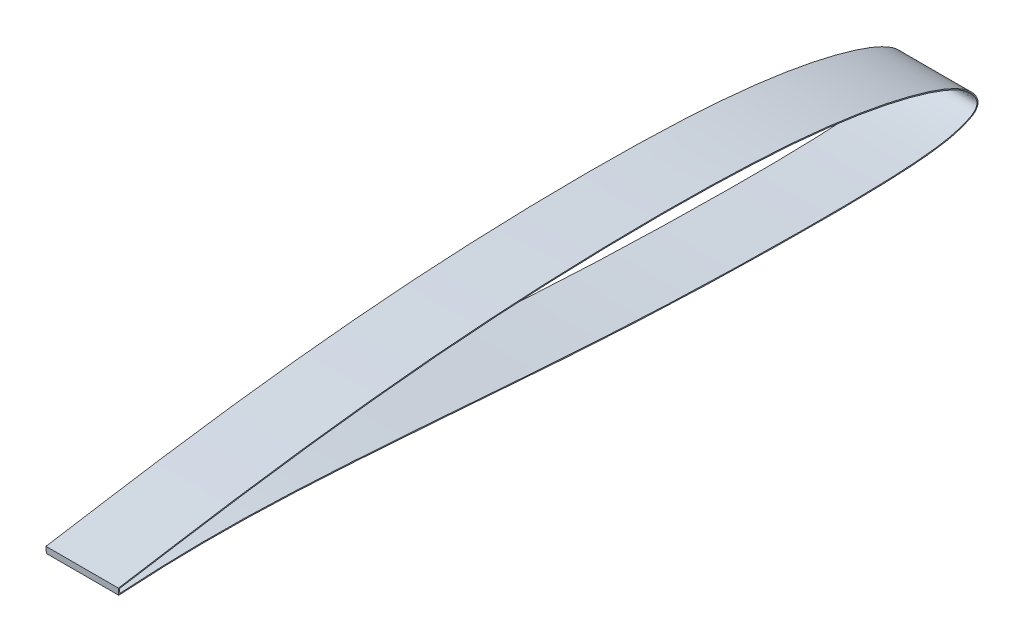
ISO-10303-21;
HEADER;
FILE_DESCRIPTION(('STEP AP214'),'2;1');
FILE_NAME('part.step','',(''),(''),'','','');
FILE_SCHEMA(('AUTOMOTIVE_DESIGN { 1 0 10303 214 1 1 1 1 }'));
ENDSEC;
DATA;
#1=APPLICATION_CONTEXT('core data for automotive mechanical design processes');
#2=APPLICATION_PROTOCOL_DEFINITION('international standard','automotive_design',2000,#1);
#3=PRODUCT_CONTEXT('',#1,'mechanical');
#4=PRODUCT('Part','Part','',(#3));
#5=PRODUCT_RELATED_PRODUCT_CATEGORY('part','',(#4));
#6=PRODUCT_DEFINITION_FORMATION('','',#4);
#7=PRODUCT_DEFINITION_CONTEXT('part definition',#1,'design');
#8=PRODUCT_DEFINITION('design','',#6,#7);
#9=PRODUCT_DEFINITION_SHAPE('','',#8);
#10=(LENGTH_UNIT() NAMED_UNIT(*) SI_UNIT(.MILLI.,.METRE.));
#11=(NAMED_UNIT(*) PLANE_ANGLE_UNIT() SI_UNIT($,.RADIAN.));
#12=(NAMED_UNIT(*) SI_UNIT($,.STERADIAN.) SOLID_ANGLE_UNIT());
#13=UNCERTAINTY_MEASURE_WITH_UNIT(LENGTH_MEASURE(1.E-05),#10,'distance_accuracy_value','');
#14=(GEOMETRIC_REPRESENTATION_CONTEXT(3) GLOBAL_UNCERTAINTY_ASSIGNED_CONTEXT((#13)) GLOBAL_UNIT_ASSIGNED_CONTEXT((#10,
#11,#12)) REPRESENTATION_CONTEXT('',''));
#15=CARTESIAN_POINT('',(0.,0.,0.));
#16=DIRECTION('',(0.,0.,1.));
#17=DIRECTION('',(1.,0.,0.));
#18=AXIS2_PLACEMENT_3D('',#15,#16,#17);
#19=CARTESIAN_POINT('',(20.,1.64115052743639,0.171932989034191));
#20=DIRECTION('',(-1.,0.,0.));
#21=DIRECTION('',(0.,0.,1.));
#22=AXIS2_PLACEMENT_3D('',#19,#20,#21);
#23=PLANE('',#22);
#24=CARTESIAN_POINT('',(20.,0.00851203113730381,250.299879217896));
#25=CARTESIAN_POINT('',(20.,-0.0415942590162992,250.300610440767));
#26=CARTESIAN_POINT('',(20.,-0.152161860770837,250.272506801154));
#27=CARTESIAN_POINT('',(20.,-0.259965331737343,250.167522590776));
#28=CARTESIAN_POINT('',(20.,-0.284593038341012,250.096781737222));
#29=CARTESIAN_POINT('',(20.,-0.295657832195406,250.057124680893));
#30=CARTESIAN_POINT('',(20.,-0.299589513553123,250.026592719769));
#31=CARTESIAN_POINT('',(20.,-0.300788545775397,250.007637867982));
#32=CARTESIAN_POINT('',(20.,-0.301054379074273,249.988212512625));
#33=CARTESIAN_POINT('',(20.,-0.30059721191853,249.972342631143));
#34=CARTESIAN_POINT('',(20.,-0.299715526481863,249.954348045777));
#35=CARTESIAN_POINT('',(20.,-0.298497464499674,249.93549893126));
#36=CARTESIAN_POINT('',(20.,-0.296458505735992,249.907843325712));
#37=CARTESIAN_POINT('',(20.,-0.293133835202882,249.867841257151));
#38=CARTESIAN_POINT('',(20.,-0.287998729290465,249.810943218763));
#39=CARTESIAN_POINT('',(20.,-0.279801997220732,249.724390350209));
#40=CARTESIAN_POINT('',(20.,-0.267388415798908,249.59880987299));
#41=CARTESIAN_POINT('',(20.,-0.25031768000012,249.430459515597));
#42=CARTESIAN_POINT('',(20.,-0.226273804968027,249.195382682965));
#43=CARTESIAN_POINT('',(20.,-0.198009291952686,248.915327795734));
#44=CARTESIAN_POINT('',(20.,-0.168358731904941,248.612353141811));
#45=CARTESIAN_POINT('',(20.,-0.133192974381476,248.242015094353));
#46=CARTESIAN_POINT('',(20.,-0.0964390058673635,247.834242708697));
#47=CARTESIAN_POINT('',(20.,-0.0595236681232221,247.398464530492));
#48=CARTESIAN_POINT('',(20.,-0.01480301413068,246.847910816136));
#49=CARTESIAN_POINT('',(20.,0.0458874341870452,246.111558123038));
#50=CARTESIAN_POINT('',(20.,0.128254179339114,245.137192793484));
#51=CARTESIAN_POINT('',(20.,0.243670253642688,243.772743085392));
#52=CARTESIAN_POINT('',(20.,0.38650761134497,242.03921317083));
#53=CARTESIAN_POINT('',(20.,0.536484673338993,240.063200336767));
#54=CARTESIAN_POINT('',(20.,0.673723383554997,238.119323561757));
#55=CARTESIAN_POINT('',(20.,0.802802158334246,236.16814930186));
#56=CARTESIAN_POINT('',(20.,0.96625171519915,233.536179450592));
#57=CARTESIAN_POINT('',(20.,1.14972586909803,230.220754521479));
#58=CARTESIAN_POINT('',(20.,1.32686721965274,226.261301818986));
#59=CARTESIAN_POINT('',(20.,1.46217380664256,222.310221851806));
#60=CARTESIAN_POINT('',(20.,1.58907599436371,217.034536948074));
#61=CARTESIAN_POINT('',(20.,1.6469298796479,210.429947600971));
#62=CARTESIAN_POINT('',(20.,1.55709956014121,202.510880005302));
#63=CARTESIAN_POINT('',(20.,1.32519296729882,194.592958559664));
#64=CARTESIAN_POINT('',(20.,0.981660944201321,186.677117851058));
#65=CARTESIAN_POINT('',(20.,0.556908077384676,178.765161733083));
#66=CARTESIAN_POINT('',(20.,-0.0953813518286871,168.219890218321));
#67=CARTESIAN_POINT('',(20.,-1.03300992275131,155.045066006488));
#68=CARTESIAN_POINT('',(20.,-2.25260262489353,139.240809074306));
#69=CARTESIAN_POINT('',(20.,-3.47583234832261,123.434827002437));
#70=CARTESIAN_POINT('',(20.,-4.58801164903379,107.618458499));
#71=CARTESIAN_POINT('',(20.,-5.50274193406635,91.7874036901302));
#72=CARTESIAN_POINT('',(20.,-6.1403455161051,75.9420509706974));
#73=CARTESIAN_POINT('',(20.,-6.47354050568013,62.7323307612574));
#74=CARTESIAN_POINT('',(20.,-6.62266457095368,52.1619890918186));
#75=CARTESIAN_POINT('',(20.,-6.67662273312011,44.2337883177737));
#76=CARTESIAN_POINT('',(20.,-6.65180486570018,36.3035722319282));
#77=CARTESIAN_POINT('',(20.,-6.5383913921192,29.6953885399139));
#78=CARTESIAN_POINT('',(20.,-6.36948129754015,24.4096595558014));
#79=CARTESIAN_POINT('',(20.,-6.19087464614657,20.4450845113171));
#80=CARTESIAN_POINT('',(20.,-5.93272568729475,16.4805457366008));
#81=CARTESIAN_POINT('',(20.,-5.60860396178254,13.1862938546496));
#82=CARTESIAN_POINT('',(20.,-5.2491338916079,10.557305657677));
#83=CARTESIAN_POINT('',(20.,-4.92242309276855,8.58672384675019));
#84=CARTESIAN_POINT('',(20.,-4.51037612301015,6.62418506968199));
#85=CARTESIAN_POINT('',(20.,-3.96742217417539,4.70180291861749));
#86=CARTESIAN_POINT('',(20.,-3.36948122727044,3.14556823052178));
#87=CARTESIAN_POINT('',(20.,-2.80392657496438,1.91276072032612));
#88=CARTESIAN_POINT('',(20.,-2.29354760260437,0.982008538494683));
#89=CARTESIAN_POINT('',(20.,-1.55522549396738,0.178982490652044));
#90=CARTESIAN_POINT('',(20.,-0.496131147539051,-0.338488685918497));
#91=CARTESIAN_POINT('',(20.,0.66623021235439,-0.288782614579684));
#92=CARTESIAN_POINT('',(20.,1.66028447300926,0.145287130403116));
#93=CARTESIAN_POINT('',(20.,2.53953506022693,0.739232027172366));
#94=CARTESIAN_POINT('',(20.,3.57641854124955,1.63563228476054));
#95=CARTESIAN_POINT('',(20.,4.6695547992918,2.92702851972945));
#96=CARTESIAN_POINT('',(20.,5.76071964309172,4.63071264774603));
#97=CARTESIAN_POINT('',(20.,7.00300428073947,7.00397618105125));
#98=CARTESIAN_POINT('',(20.,8.27555058181624,10.0760477559024));
#99=CARTESIAN_POINT('',(20.,9.54863179222154,13.8500487910829));
#100=CARTESIAN_POINT('',(20.,10.6446468339172,17.6723181061434));
#101=CARTESIAN_POINT('',(20.,11.6040940057227,21.5281681384073));
#102=CARTESIAN_POINT('',(20.,12.4500429705219,25.4090120272593));
#103=CARTESIAN_POINT('',(20.,13.4442203011166,30.6095562582757));
#104=CARTESIAN_POINT('',(20.,14.4647029262623,37.1477758620433));
#105=CARTESIAN_POINT('',(20.,15.389882750319,45.0316530020749));
#106=CARTESIAN_POINT('',(20.,16.0751673303074,52.9375622296353));
#107=CARTESIAN_POINT('',(20.,16.717282738099,63.4965273693013));
#108=CARTESIAN_POINT('',(20.,17.1232341843218,76.7106493306953));
#109=CARTESIAN_POINT('',(20.,17.1665689752416,92.5715622604681));
#110=CARTESIAN_POINT('',(20.,16.8536913769647,108.428137058977));
#111=CARTESIAN_POINT('',(20.,16.2031863115242,124.274557363491));
#112=CARTESIAN_POINT('',(20.,15.2035262569515,140.103392113993));
#113=CARTESIAN_POINT('',(20.,13.8412029927248,155.904723236483));
#114=CARTESIAN_POINT('',(20.,12.4307180655359,169.045219163134));
#115=CARTESIAN_POINT('',(20.,11.1567106146635,179.539970397058));
#116=CARTESIAN_POINT('',(20.,10.1363332211165,187.402578879519));
#117=CARTESIAN_POINT('',(20.,9.05647641624516,195.257205957175));
#118=CARTESIAN_POINT('',(20.,7.91030198513163,203.102654505584));
#119=CARTESIAN_POINT('',(20.,6.9341104582187,209.634889855681));
#120=CARTESIAN_POINT('',(20.,6.12428239086284,214.859058701329));
#121=CARTESIAN_POINT('',(20.,5.48260716601222,218.773874391536));
#122=CARTESIAN_POINT('',(20.,4.82875900695875,222.68293450718));
#123=CARTESIAN_POINT('',(20.,4.20774534932606,226.588844765037));
#124=CARTESIAN_POINT('',(20.,3.60557746178636,230.501835449157));
#125=CARTESIAN_POINT('',(20.,3.07275233506809,233.781525609078));
#126=CARTESIAN_POINT('',(20.,2.63110552351447,236.392965845949));
#127=CARTESIAN_POINT('',(20.,2.29774313988503,238.333354657877));
#128=CARTESIAN_POINT('',(20.,1.96460897495937,240.252683871098));
#129=CARTESIAN_POINT('',(20.,1.62649118011434,242.193677466078));
#130=CARTESIAN_POINT('',(20.,1.3318083301473,243.894652446307));
#131=CARTESIAN_POINT('',(20.,1.09666527197546,245.252120397561));
#132=CARTESIAN_POINT('',(20.,0.927374906918746,246.224060084316));
#133=CARTESIAN_POINT('',(20.,0.796992844238262,246.962025587189));
#134=CARTESIAN_POINT('',(20.,0.700103889784776,247.506780942721));
#135=CARTESIAN_POINT('',(20.,0.626247063403914,247.934491212951));
#136=CARTESIAN_POINT('',(20.,0.547252532052911,248.414721591915));
#137=CARTESIAN_POINT('',(20.,0.473912491142221,248.88621611927));
#138=CARTESIAN_POINT('',(20.,0.416437297216251,249.272448082603));
#139=CARTESIAN_POINT('',(20.,0.382284542223371,249.505498980371));
#140=CARTESIAN_POINT('',(20.,0.357670364391624,249.672888150817));
#141=CARTESIAN_POINT('',(20.,0.33523840660703,249.823102083426));
#142=CARTESIAN_POINT('',(20.,0.319429054490912,249.925200337912));
#143=CARTESIAN_POINT('',(20.,0.308881064404215,249.989180993184));
#144=CARTESIAN_POINT('',(20.,0.303156345245627,250.021549375076));
#145=CARTESIAN_POINT('',(20.,0.29848702773046,250.045077431635));
#146=CARTESIAN_POINT('',(20.,0.295141094374167,250.06041868433));
#147=CARTESIAN_POINT('',(20.,0.290475070287641,250.078197565358));
#148=CARTESIAN_POINT('',(20.,0.285375112196109,250.094934342959));
#149=CARTESIAN_POINT('',(20.,0.275869265378229,250.119839811538));
#150=CARTESIAN_POINT('',(20.,0.260523409786759,250.150358902535));
#151=CARTESIAN_POINT('',(20.,0.230138400144907,250.199654855489));
#152=CARTESIAN_POINT('',(20.,0.148475880150781,250.268119463925));
#153=CARTESIAN_POINT('',(20.,0.0586183212909068,250.299147995024));
#154=CARTESIAN_POINT('',(20.,0.00851203113730381,250.299879217896));
#155=B_SPLINE_CURVE_WITH_KNOTS('',3,(#24,#25,#26,#27,#28,#29,#30,#31,#32,#33,#34,#35,#36,#37,
#38,#39,#40,#41,#42,#43,#44,#45,#46,#47,#48,#49,#50,#51,#52,#53,#54,#55,#56,#57,#58,#59,#60,#61,
#62,#63,#64,#65,#66,#67,#68,#69,#70,#71,#72,#73,#74,#75,#76,#77,#78,#79,#80,#81,#82,#83,#84,#85,
#86,#87,#88,#89,#90,#91,#92,#93,#94,#95,#96,#97,#98,#99,#100,#101,#102,#103,#104,#105,#106,#107,
#108,#109,#110,#111,#112,#113,#114,#115,#116,#117,#118,#119,#120,#121,#122,#123,#124,#125,#126,
#127,#128,#129,#130,#131,#132,#133,#134,#135,#136,#137,#138,#139,#140,#141,#142,#143,#144,#145,
#146,#147,#148,#149,#150,#151,#152,#153,#154),.UNSPECIFIED.,.T.,.F.,(4,1,1,1,1,1,1,1,1,1,1,1,1,
1,1,1,1,1,1,1,1,1,1,1,1,1,1,1,1,1,1,1,1,1,1,1,1,1,1,1,1,1,1,1,1,1,1,1,1,1,1,1,1,1,1,1,1,1,1,1,1,
1,1,1,1,1,1,1,1,1,1,1,1,1,1,1,1,1,1,1,1,1,1,1,1,1,1,1,1,1,1,1,1,1,1,1,1,1,1,1,1,1,1,1,1,1,1,1,1,
1,1,1,1,1,1,1,1,1,1,1,1,1,1,1,1,1,1,1,4),(0.,7.62939453125E-06,1.52587890625E-05,
3.0517578125E-05,4.57763671875E-05,6.103515625E-05,9.1552734375E-05,0.0001220703125,
0.00018310546875,0.000244140625,0.00030517578125,0.0003662109375,0.00048828125,0.0006103515625,
0.000732421875,0.0009765625,0.001220703125,0.00146484375,0.001953125,0.00244140625,0.0029296875,
0.00390625,0.0048828125,0.005859375,0.0078125,0.009765625,0.01171875,0.015625,0.01953125,
0.0234375,0.02734375,0.03125,0.0390625,0.046875,0.0546875,0.0625,0.078125,0.09375,0.109375,
0.125,0.140625,0.15625,0.1875,0.21875,0.25,0.28125,0.3125,0.34375,0.375,0.390625,0.40625,
0.421875,0.4375,0.4453125,0.453125,0.4609375,0.46875,0.47265625,0.4765625,0.48046875,0.484375,
0.48828125,0.490234375,0.4921875,0.494140625,0.49609375,0.498046875,0.5,0.501953125,0.50390625,
0.5078125,0.51171875,0.515625,0.5234375,0.53125,0.5390625,0.546875,0.5546875,0.5625,0.578125,
0.59375,0.609375,0.625,0.65625,0.6875,0.71875,0.75,0.78125,0.8125,0.84375,0.859375,0.875,
0.890625,0.90625,0.921875,0.9296875,0.9375,0.9453125,0.953125,0.9609375,0.96875,0.97265625,
0.9765625,0.98046875,0.984375,0.98828125,0.990234375,0.9921875,0.994140625,0.9951171875,
0.99609375,0.9970703125,0.998046875,0.99853515625,0.998779296875,0.9990234375,0.999267578125,
0.99951171875,0.9996337890625,0.999755859375,0.99981689453125,0.9998779296875,0.999908447265625,
0.99993896484375,0.999954223632812,0.999969482421875,0.999984741210938,0.999992370605469,1.),.UNSPECIFIED.);
#156=CARTESIAN_POINT('',(20.,0.770284292099785,236.650797006776));
#157=VERTEX_POINT('',#156);
#158=CARTESIAN_POINT('',(20.,2.51868264714181,237.045729829817));
#159=VERTEX_POINT('',#158);
#160=EDGE_CURVE('E122',#157,#159,#155,.T.);
#161=ORIENTED_EDGE('',*,*,#160,.T.);
#162=DIRECTION('',(0.,-0.998451108391889,-0.0556361766390155));
#163=VECTOR('',#162,1.);
#164=CARTESIAN_POINT('',(20.,-13.1600945307642,236.172069407968));
#165=LINE('',#164,#163);
#166=CARTESIAN_POINT('',(20.0025,2.21720517010672,237.028930755708));
#167=VERTEX_POINT('',#166);
#168=EDGE_CURVE('E115',#159,#167,#165,.T.);
#169=ORIENTED_EDGE('',*,*,#168,.T.);
#170=CARTESIAN_POINT('',(20.005,2.26814469832964,236.731303844471));
#171=DIRECTION('',(0.,-0.168699264399904,0.985667569818005));
#172=VECTOR('',#171,1.);
#173=LINE('',#170,#172);
#174=CARTESIAN_POINT('',(20.0024952069622,2.26813996456745,236.731303036409));
#175=VERTEX_POINT('',#174);
#176=EDGE_CURVE('E97',#175,#167,#173,.T.);
#177=ORIENTED_EDGE('',*,*,#176,.F.);
#178=CARTESIAN_POINT('',(20.,1.07000336824573,236.664540432712));
#179=CARTESIAN_POINT('',(20.,1.20938711733215,234.52568603359));
#180=CARTESIAN_POINT('',(20.,1.50516401144657,229.475821130915));
#181=CARTESIAN_POINT('',(20.,1.8232186026768,221.18415869828));
#182=CARTESIAN_POINT('',(20.,1.96762610068065,211.337618207726));
#183=CARTESIAN_POINT('',(20.,1.83322105638369,200.371188527109));
#184=CARTESIAN_POINT('',(20.,1.38960528984164,188.499913622482));
#185=CARTESIAN_POINT('',(20.,0.706014078000893,175.953687417433));
#186=CARTESIAN_POINT('',(20.,-0.160208641561513,162.931424917666));
#187=CARTESIAN_POINT('',(20.,-1.14801632724376,149.615771743617));
#188=CARTESIAN_POINT('',(20.,-2.19092490983926,136.176354994724));
#189=CARTESIAN_POINT('',(20.,-3.21958397917046,122.767140548026));
#190=CARTESIAN_POINT('',(20.,-4.15274312671142,109.520053587455));
#191=CARTESIAN_POINT('',(20.,-4.93856436487493,96.5460959745437));
#192=CARTESIAN_POINT('',(20.,-5.53683070268675,83.9408193016427));
#193=CARTESIAN_POINT('',(20.,-5.94764820461108,71.8018392906514));
#194=CARTESIAN_POINT('',(20.,-6.21845093878312,60.2452560030716));
#195=CARTESIAN_POINT('',(20.,-6.35536975583973,49.3987328907547));
#196=CARTESIAN_POINT('',(20.,-6.38138796281789,39.3972261942655));
#197=CARTESIAN_POINT('',(20.,-6.26504923032313,30.3619348419668));
#198=CARTESIAN_POINT('',(20.,-6.01216491688521,22.4121811031587));
#199=CARTESIAN_POINT('',(20.,-5.59743390072595,15.6262272306516));
#200=CARTESIAN_POINT('',(20.,-4.92870657935606,10.0719075109048));
#201=CARTESIAN_POINT('',(20.,-4.04044698146404,5.69769261214423));
#202=CARTESIAN_POINT('',(20.,-2.8657529844069,2.62532063874475));
#203=CARTESIAN_POINT('',(20.,-1.7115284699546,0.494884225045661));
#204=CARTESIAN_POINT('',(20.,-0.410454230626488,-0.0213125491030087));
#205=CARTESIAN_POINT('',(20.,0.792659826704065,0.0311691995850224));
#206=CARTESIAN_POINT('',(20.,2.30568433693192,0.812599241892923));
#207=CARTESIAN_POINT('',(20.,4.23835242447377,2.72886351673443));
#208=CARTESIAN_POINT('',(20.,6.11817212106947,5.76990724125498));
#209=CARTESIAN_POINT('',(20.,7.91359420170391,9.88094280419771));
#210=CARTESIAN_POINT('',(20.,9.64131817838287,15.0749304677094));
#211=CARTESIAN_POINT('',(20.,11.2838964878058,21.2987522216172));
#212=CARTESIAN_POINT('',(20.,12.7883817585812,28.4971721202648));
#213=CARTESIAN_POINT('',(20.,14.0978349081275,36.6073734062479));
#214=CARTESIAN_POINT('',(20.,15.1594290171638,45.573028440303));
#215=CARTESIAN_POINT('',(20.,15.9609039979753,55.3329100744701));
#216=CARTESIAN_POINT('',(20.,16.4940697383882,65.8165364983871));
#217=CARTESIAN_POINT('',(20.,16.7919897051422,76.9313762604552));
#218=CARTESIAN_POINT('',(20.,16.864754130909,88.5669490281142));
#219=CARTESIAN_POINT('',(20.,16.7267152914356,100.596999885542));
#220=CARTESIAN_POINT('',(20.,16.3833850637257,112.888825982424));
#221=CARTESIAN_POINT('',(20.,15.825573666627,125.31161581915));
#222=CARTESIAN_POINT('',(20.,15.0523318700684,137.743791097076));
#223=CARTESIAN_POINT('',(20.,14.0593390742259,150.072384382085));
#224=CARTESIAN_POINT('',(20.,12.8815869860292,162.191375055682));
#225=CARTESIAN_POINT('',(20.,11.5492803460744,173.989074322246));
#226=CARTESIAN_POINT('',(20.,10.1162497290333,185.35236444642));
#227=CARTESIAN_POINT('',(20.,8.63237912523508,196.163081697706));
#228=CARTESIAN_POINT('',(20.,7.13151388385034,206.300441402258));
#229=CARTESIAN_POINT('',(20.,5.73122176805054,215.560350587015));
#230=CARTESIAN_POINT('',(20.,4.29329512716244,223.97715704258));
#231=CARTESIAN_POINT('',(20.,3.25193510165877,230.897397413297));
#232=CARTESIAN_POINT('',(20.,2.54483353426827,235.112832904621));
#233=CARTESIAN_POINT('',(20.,2.26814469812949,236.731303845642));
#234=B_SPLINE_CURVE_WITH_KNOTS('',3,(#178,#179,#180,#181,#182,#183,#184,#185,#186,#187,#188,
#189,#190,#191,#192,#193,#194,#195,#196,#197,#198,#199,#200,#201,#202,#203,#204,#205,#206,#207,
#208,#209,#210,#211,#212,#213,#214,#215,#216,#217,#218,#219,#220,#221,#222,#223,#224,#225,#226,
#227,#228,#229,#230,#231,#232,#233),.UNSPECIFIED.,.F.,.F.,(4,1,1,1,1,1,1,1,1,1,1,1,1,1,1,1,1,1,
1,1,1,1,1,1,1,1,1,1,1,1,1,1,1,1,1,1,1,1,1,1,1,1,1,1,1,1,1,1,1,1,1,1,1,4),(0.0263864426753588,
0.0391734833267743,0.0560606311759249,0.0755789238487882,0.0973636066296903,0.120926258366677,
0.145825281006277,0.171670911815127,0.198108536705041,0.22479018357162,0.25139057978404,
0.277643490654311,0.303326750051388,0.328257458029316,0.352272548115194,0.375156061746876,
0.396620664402003,0.416422729294005,0.434304420097656,0.450054679859308,0.463465465082325,
0.474478994238096,0.483169222153171,0.489678354497499,0.494104066315722,0.496910015324886,
0.497289784891853,0.501214273282496,0.506457950332762,0.51335695674223,0.522168631834455,
0.53296596992453,0.545689209241574,0.56022077890382,0.57643892310517,0.594258689005965,
0.613600244568652,0.634342385932902,0.656331109263004,0.679351893859712,0.703152302846811,
0.727478208080039,0.7520707394079,0.776691163534608,0.801140183976245,0.825214386971546,
0.848697423570622,0.871352857669295,0.892947448931157,0.913230871058069,0.931955467148994,
0.94834206907442,0.963693004275676,0.973442162584554),.UNSPECIFIED.);
#235=CARTESIAN_POINT('',(20.0024980207906,1.07000139166205,236.664540303903));
#236=VERTEX_POINT('',#235);
#237=EDGE_CURVE('E180',#236,#175,#234,.T.);
#238=ORIENTED_EDGE('',*,*,#237,.F.);
#239=CARTESIAN_POINT('',(20.005,1.05040053338072,236.963913482786));
#240=DIRECTION('',(0.,0.0653396995590279,-0.997863078614263));
#241=VECTOR('',#240,1.);
#242=LINE('',#239,#241);
#243=CARTESIAN_POINT('',(20.0025,1.05040053274584,236.963913492436));
#244=VERTEX_POINT('',#243);
#245=EDGE_CURVE('E170',#244,#236,#242,.T.);
#246=ORIENTED_EDGE('',*,*,#245,.F.);
#247=CARTESIAN_POINT('',(20.,0.750882575448525,236.94722361732));
#248=VERTEX_POINT('',#247);
#249=EDGE_CURVE('E118',#244,#248,#165,.T.);
#250=ORIENTED_EDGE('',*,*,#249,.T.);
#251=CARTESIAN_POINT('',(20.,0.751077425204046,236.944260895975));
#252=VERTEX_POINT('',#251);
#253=EDGE_CURVE('E11',#248,#252,#155,.T.);
#254=ORIENTED_EDGE('',*,*,#253,.T.);
#255=CARTESIAN_POINT('',(20.,0.770284292099785,236.650797006776));
#256=CARTESIAN_POINT('',(20.,0.763908222943987,236.748686502742));
#257=CARTESIAN_POINT('',(20.,0.757506246980303,236.846504890068));
#258=CARTESIAN_POINT('',(20.,0.751077425204051,236.944260895975));
#259=B_SPLINE_CURVE_WITH_KNOTS('',3,(#255,#256,#257,#258),.UNSPECIFIED.,.F.,.F.,(4,4),
(0.0257881631056138,0.0263742192155241),.UNSPECIFIED.);
#260=EDGE_CURVE('E46',#252,#157,#259,.F.);
#261=ORIENTED_EDGE('',*,*,#260,.T.);
#262=EDGE_LOOP('',(#161,#169,#177,#238,#246,#250,#254,#261));
#263=FACE_BOUND('',#262,.T.);
#264=ADVANCED_FACE('F34',(#263),#23,.F.);
#265=CARTESIAN_POINT('',(0.,1.64115052743639,0.171932989034191));
#266=DIRECTION('',(-1.,0.,0.));
#267=DIRECTION('',(0.,0.,1.));
#268=AXIS2_PLACEMENT_3D('',#265,#266,#267);
#269=PLANE('',#268);
#270=DIRECTION('',(0.,-0.998451108391889,-0.0556361766390155));
#271=VECTOR('',#270,1.);
#272=CARTESIAN_POINT('',(0.,-13.1600945307642,236.172069407968));
#273=LINE('',#272,#271);
#274=CARTESIAN_POINT('',(0.,2.51868264714181,237.045729829817));
#275=VERTEX_POINT('',#274);
#276=CARTESIAN_POINT('',(0.,0.750882575448525,236.94722361732));
#277=VERTEX_POINT('',#276);
#278=EDGE_CURVE('E127',#275,#277,#273,.T.);
#279=ORIENTED_EDGE('',*,*,#278,.F.);
#280=CARTESIAN_POINT('',(0.,0.00851203113730381,250.299879217896));
#281=CARTESIAN_POINT('',(0.,-0.0415942590162992,250.300610440767));
#282=CARTESIAN_POINT('',(0.,-0.152161860770837,250.272506801154));
#283=CARTESIAN_POINT('',(0.,-0.259965331737343,250.167522590776));
#284=CARTESIAN_POINT('',(0.,-0.284593038341012,250.096781737222));
#285=CARTESIAN_POINT('',(0.,-0.295657832195406,250.057124680893));
#286=CARTESIAN_POINT('',(0.,-0.299589513553123,250.026592719769));
#287=CARTESIAN_POINT('',(0.,-0.300788545775397,250.007637867982));
#288=CARTESIAN_POINT('',(0.,-0.301054379074273,249.988212512625));
#289=CARTESIAN_POINT('',(0.,-0.30059721191853,249.972342631143));
#290=CARTESIAN_POINT('',(0.,-0.299715526481863,249.954348045777));
#291=CARTESIAN_POINT('',(0.,-0.298497464499674,249.93549893126));
#292=CARTESIAN_POINT('',(0.,-0.296458505735992,249.907843325712));
#293=CARTESIAN_POINT('',(0.,-0.293133835202882,249.867841257151));
#294=CARTESIAN_POINT('',(0.,-0.287998729290465,249.810943218763));
#295=CARTESIAN_POINT('',(0.,-0.279801997220732,249.724390350209));
#296=CARTESIAN_POINT('',(0.,-0.267388415798908,249.59880987299));
#297=CARTESIAN_POINT('',(0.,-0.25031768000012,249.430459515597));
#298=CARTESIAN_POINT('',(0.,-0.226273804968027,249.195382682965));
#299=CARTESIAN_POINT('',(0.,-0.198009291952686,248.915327795734));
#300=CARTESIAN_POINT('',(0.,-0.168358731904941,248.612353141811));
#301=CARTESIAN_POINT('',(0.,-0.133192974381476,248.242015094353));
#302=CARTESIAN_POINT('',(0.,-0.0964390058673635,247.834242708697));
#303=CARTESIAN_POINT('',(0.,-0.0595236681232221,247.398464530492));
#304=CARTESIAN_POINT('',(0.,-0.01480301413068,246.847910816136));
#305=CARTESIAN_POINT('',(0.,0.0458874341870452,246.111558123038));
#306=CARTESIAN_POINT('',(0.,0.128254179339114,245.137192793484));
#307=CARTESIAN_POINT('',(0.,0.243670253642688,243.772743085392));
#308=CARTESIAN_POINT('',(0.,0.38650761134497,242.03921317083));
#309=CARTESIAN_POINT('',(0.,0.536484673338993,240.063200336767));
#310=CARTESIAN_POINT('',(0.,0.673723383554997,238.119323561757));
#311=CARTESIAN_POINT('',(0.,0.802802158334246,236.16814930186));
#312=CARTESIAN_POINT('',(0.,0.96625171519915,233.536179450592));
#313=CARTESIAN_POINT('',(0.,1.14972586909803,230.220754521479));
#314=CARTESIAN_POINT('',(0.,1.32686721965274,226.261301818986));
#315=CARTESIAN_POINT('',(0.,1.46217380664256,222.310221851806));
#316=CARTESIAN_POINT('',(0.,1.58907599436371,217.034536948074));
#317=CARTESIAN_POINT('',(0.,1.6469298796479,210.429947600971));
#318=CARTESIAN_POINT('',(0.,1.55709956014121,202.510880005302));
#319=CARTESIAN_POINT('',(0.,1.32519296729882,194.592958559664));
#320=CARTESIAN_POINT('',(0.,0.981660944201321,186.677117851058));
#321=CARTESIAN_POINT('',(0.,0.556908077384676,178.765161733083));
#322=CARTESIAN_POINT('',(0.,-0.0953813518286871,168.219890218321));
#323=CARTESIAN_POINT('',(0.,-1.03300992275131,155.045066006488));
#324=CARTESIAN_POINT('',(0.,-2.25260262489353,139.240809074306));
#325=CARTESIAN_POINT('',(0.,-3.47583234832261,123.434827002437));
#326=CARTESIAN_POINT('',(0.,-4.58801164903379,107.618458499));
#327=CARTESIAN_POINT('',(0.,-5.50274193406635,91.7874036901302));
#328=CARTESIAN_POINT('',(0.,-6.1403455161051,75.9420509706974));
#329=CARTESIAN_POINT('',(0.,-6.47354050568013,62.7323307612574));
#330=CARTESIAN_POINT('',(0.,-6.62266457095368,52.1619890918186));
#331=CARTESIAN_POINT('',(0.,-6.67662273312011,44.2337883177737));
#332=CARTESIAN_POINT('',(0.,-6.65180486570018,36.3035722319282));
#333=CARTESIAN_POINT('',(0.,-6.5383913921192,29.6953885399139));
#334=CARTESIAN_POINT('',(0.,-6.36948129754015,24.4096595558014));
#335=CARTESIAN_POINT('',(0.,-6.19087464614657,20.4450845113171));
#336=CARTESIAN_POINT('',(0.,-5.93272568729475,16.4805457366008));
#337=CARTESIAN_POINT('',(0.,-5.60860396178254,13.1862938546496));
#338=CARTESIAN_POINT('',(0.,-5.2491338916079,10.557305657677));
#339=CARTESIAN_POINT('',(0.,-4.92242309276855,8.58672384675019));
#340=CARTESIAN_POINT('',(0.,-4.51037612301015,6.62418506968199));
#341=CARTESIAN_POINT('',(0.,-3.96742217417539,4.70180291861749));
#342=CARTESIAN_POINT('',(0.,-3.36948122727044,3.14556823052178));
#343=CARTESIAN_POINT('',(0.,-2.80392657496438,1.91276072032612));
#344=CARTESIAN_POINT('',(0.,-2.29354760260437,0.982008538494683));
#345=CARTESIAN_POINT('',(0.,-1.55522549396738,0.178982490652044));
#346=CARTESIAN_POINT('',(0.,-0.496131147539051,-0.338488685918497));
#347=CARTESIAN_POINT('',(0.,0.66623021235439,-0.288782614579684));
#348=CARTESIAN_POINT('',(0.,1.66028447300926,0.145287130403116));
#349=CARTESIAN_POINT('',(0.,2.53953506022693,0.739232027172366));
#350=CARTESIAN_POINT('',(0.,3.57641854124955,1.63563228476054));
#351=CARTESIAN_POINT('',(0.,4.6695547992918,2.92702851972945));
#352=CARTESIAN_POINT('',(0.,5.76071964309172,4.63071264774603));
#353=CARTESIAN_POINT('',(0.,7.00300428073947,7.00397618105125));
#354=CARTESIAN_POINT('',(0.,8.27555058181624,10.0760477559024));
#355=CARTESIAN_POINT('',(0.,9.54863179222154,13.8500487910829));
#356=CARTESIAN_POINT('',(0.,10.6446468339172,17.6723181061434));
#357=CARTESIAN_POINT('',(0.,11.6040940057227,21.5281681384073));
#358=CARTESIAN_POINT('',(0.,12.4500429705219,25.4090120272593));
#359=CARTESIAN_POINT('',(0.,13.4442203011166,30.6095562582757));
#360=CARTESIAN_POINT('',(0.,14.4647029262623,37.1477758620433));
#361=CARTESIAN_POINT('',(0.,15.389882750319,45.0316530020749));
#362=CARTESIAN_POINT('',(0.,16.0751673303074,52.9375622296353));
#363=CARTESIAN_POINT('',(0.,16.717282738099,63.4965273693013));
#364=CARTESIAN_POINT('',(0.,17.1232341843218,76.7106493306953));
#365=CARTESIAN_POINT('',(0.,17.1665689752416,92.5715622604681));
#366=CARTESIAN_POINT('',(0.,16.8536913769647,108.428137058977));
#367=CARTESIAN_POINT('',(0.,16.2031863115242,124.274557363491));
#368=CARTESIAN_POINT('',(0.,15.2035262569515,140.103392113993));
#369=CARTESIAN_POINT('',(0.,13.8412029927248,155.904723236483));
#370=CARTESIAN_POINT('',(0.,12.4307180655359,169.045219163134));
#371=CARTESIAN_POINT('',(0.,11.1567106146635,179.539970397058));
#372=CARTESIAN_POINT('',(0.,10.1363332211165,187.402578879519));
#373=CARTESIAN_POINT('',(0.,9.05647641624516,195.257205957175));
#374=CARTESIAN_POINT('',(0.,7.91030198513163,203.102654505584));
#375=CARTESIAN_POINT('',(0.,6.9341104582187,209.634889855681));
#376=CARTESIAN_POINT('',(0.,6.12428239086284,214.859058701329));
#377=CARTESIAN_POINT('',(0.,5.48260716601222,218.773874391536));
#378=CARTESIAN_POINT('',(0.,4.82875900695875,222.68293450718));
#379=CARTESIAN_POINT('',(0.,4.20774534932606,226.588844765037));
#380=CARTESIAN_POINT('',(0.,3.60557746178636,230.501835449157));
#381=CARTESIAN_POINT('',(0.,3.07275233506809,233.781525609078));
#382=CARTESIAN_POINT('',(0.,2.63110552351447,236.392965845949));
#383=CARTESIAN_POINT('',(0.,2.29774313988503,238.333354657877));
#384=CARTESIAN_POINT('',(0.,1.96460897495937,240.252683871098));
#385=CARTESIAN_POINT('',(0.,1.62649118011434,242.193677466078));
#386=CARTESIAN_POINT('',(0.,1.3318083301473,243.894652446307));
#387=CARTESIAN_POINT('',(0.,1.09666527197546,245.252120397561));
#388=CARTESIAN_POINT('',(0.,0.927374906918746,246.224060084316));
#389=CARTESIAN_POINT('',(0.,0.796992844238262,246.962025587189));
#390=CARTESIAN_POINT('',(0.,0.700103889784776,247.506780942721));
#391=CARTESIAN_POINT('',(0.,0.626247063403914,247.934491212951));
#392=CARTESIAN_POINT('',(0.,0.547252532052911,248.414721591915));
#393=CARTESIAN_POINT('',(0.,0.473912491142221,248.88621611927));
#394=CARTESIAN_POINT('',(0.,0.416437297216251,249.272448082603));
#395=CARTESIAN_POINT('',(0.,0.382284542223371,249.505498980371));
#396=CARTESIAN_POINT('',(0.,0.357670364391624,249.672888150817));
#397=CARTESIAN_POINT('',(0.,0.33523840660703,249.823102083426));
#398=CARTESIAN_POINT('',(0.,0.319429054490912,249.925200337912));
#399=CARTESIAN_POINT('',(0.,0.308881064404215,249.989180993184));
#400=CARTESIAN_POINT('',(0.,0.303156345245627,250.021549375076));
#401=CARTESIAN_POINT('',(0.,0.29848702773046,250.045077431635));
#402=CARTESIAN_POINT('',(0.,0.295141094374167,250.06041868433));
#403=CARTESIAN_POINT('',(0.,0.290475070287641,250.078197565358));
#404=CARTESIAN_POINT('',(0.,0.285375112196109,250.094934342959));
#405=CARTESIAN_POINT('',(0.,0.275869265378229,250.119839811538));
#406=CARTESIAN_POINT('',(0.,0.260523409786759,250.150358902535));
#407=CARTESIAN_POINT('',(0.,0.230138400144907,250.199654855489));
#408=CARTESIAN_POINT('',(0.,0.148475880150781,250.268119463925));
#409=CARTESIAN_POINT('',(0.,0.0586183212909068,250.299147995024));
#410=CARTESIAN_POINT('',(0.,0.00851203113730381,250.299879217896));
#411=B_SPLINE_CURVE_WITH_KNOTS('',3,(#280,#281,#282,#283,#284,#285,#286,#287,#288,#289,#290,
#291,#292,#293,#294,#295,#296,#297,#298,#299,#300,#301,#302,#303,#304,#305,#306,#307,#308,#309,
#310,#311,#312,#313,#314,#315,#316,#317,#318,#319,#320,#321,#322,#323,#324,#325,#326,#327,#328,
#329,#330,#331,#332,#333,#334,#335,#336,#337,#338,#339,#340,#341,#342,#343,#344,#345,#346,#347,
#348,#349,#350,#351,#352,#353,#354,#355,#356,#357,#358,#359,#360,#361,#362,#363,#364,#365,#366,
#367,#368,#369,#370,#371,#372,#373,#374,#375,#376,#377,#378,#379,#380,#381,#382,#383,#384,#385,
#386,#387,#388,#389,#390,#391,#392,#393,#394,#395,#396,#397,#398,#399,#400,#401,#402,#403,#404,
#405,#406,#407,#408,#409,#410),.UNSPECIFIED.,.T.,.F.,(4,1,1,1,1,1,1,1,1,1,1,1,1,1,1,1,1,1,1,1,1,
1,1,1,1,1,1,1,1,1,1,1,1,1,1,1,1,1,1,1,1,1,1,1,1,1,1,1,1,1,1,1,1,1,1,1,1,1,1,1,1,1,1,1,1,1,1,1,1,
1,1,1,1,1,1,1,1,1,1,1,1,1,1,1,1,1,1,1,1,1,1,1,1,1,1,1,1,1,1,1,1,1,1,1,1,1,1,1,1,1,1,1,1,1,1,1,1,
1,1,1,1,1,1,1,1,1,1,1,4),(0.,7.62939453125E-06,1.52587890625E-05,3.0517578125E-05,
4.57763671875E-05,6.103515625E-05,9.1552734375E-05,0.0001220703125,0.00018310546875,
0.000244140625,0.00030517578125,0.0003662109375,0.00048828125,0.0006103515625,0.000732421875,
0.0009765625,0.001220703125,0.00146484375,0.001953125,0.00244140625,0.0029296875,0.00390625,
0.0048828125,0.005859375,0.0078125,0.009765625,0.01171875,0.015625,0.01953125,0.0234375,
0.02734375,0.03125,0.0390625,0.046875,0.0546875,0.0625,0.078125,0.09375,0.109375,0.125,0.140625,
0.15625,0.1875,0.21875,0.25,0.28125,0.3125,0.34375,0.375,0.390625,0.40625,0.421875,0.4375,
0.4453125,0.453125,0.4609375,0.46875,0.47265625,0.4765625,0.48046875,0.484375,0.48828125,
0.490234375,0.4921875,0.494140625,0.49609375,0.498046875,0.5,0.501953125,0.50390625,0.5078125,
0.51171875,0.515625,0.5234375,0.53125,0.5390625,0.546875,0.5546875,0.5625,0.578125,0.59375,
0.609375,0.625,0.65625,0.6875,0.71875,0.75,0.78125,0.8125,0.84375,0.859375,0.875,0.890625,
0.90625,0.921875,0.9296875,0.9375,0.9453125,0.953125,0.9609375,0.96875,0.97265625,0.9765625,
0.98046875,0.984375,0.98828125,0.990234375,0.9921875,0.994140625,0.9951171875,0.99609375,
0.9970703125,0.998046875,0.99853515625,0.998779296875,0.9990234375,0.999267578125,0.99951171875,
0.9996337890625,0.999755859375,0.99981689453125,0.9998779296875,0.999908447265625,
0.99993896484375,0.999954223632812,0.999969482421875,0.999984741210938,0.999992370605469,1.),.UNSPECIFIED.);
#412=CARTESIAN_POINT('',(0.,0.770284292099785,236.650797006776));
#413=VERTEX_POINT('',#412);
#414=EDGE_CURVE('E61',#413,#275,#411,.T.);
#415=ORIENTED_EDGE('',*,*,#414,.F.);
#416=CARTESIAN_POINT('',(0.,0.751077425204051,236.944260895975));
#417=CARTESIAN_POINT('',(0.,0.757506246980303,236.846504890068));
#418=CARTESIAN_POINT('',(0.,0.763908222943987,236.748686502742));
#419=CARTESIAN_POINT('',(0.,0.770284292099785,236.650797006776));
#420=B_SPLINE_CURVE_WITH_KNOTS('',3,(#416,#417,#418,#419),.UNSPECIFIED.,.F.,.F.,(4,4),
(0.0257881631056138,0.0263742192155241),.UNSPECIFIED.);
#421=CARTESIAN_POINT('',(0.,0.751077425204046,236.944260895975));
#422=VERTEX_POINT('',#421);
#423=EDGE_CURVE('E244',#422,#413,#420,.T.);
#424=ORIENTED_EDGE('',*,*,#423,.F.);
#425=EDGE_CURVE('E235',#277,#422,#411,.T.);
#426=ORIENTED_EDGE('',*,*,#425,.F.);
#427=EDGE_LOOP('',(#279,#415,#424,#426));
#428=FACE_BOUND('',#427,.T.);
#429=CARTESIAN_POINT('',(0.,0.,250.));
#430=CARTESIAN_POINT('',(0.,-0.0080427959719715,250.000228293678));
#431=CARTESIAN_POINT('',(0.,0.172375657967406,248.284955515532));
#432=CARTESIAN_POINT('',(0.,0.308690014795419,246.518112419387));
#433=CARTESIAN_POINT('',(0.,0.685693593852336,242.189387343398));
#434=CARTESIAN_POINT('',(0.,1.07410152891603,236.806461263496));
#435=CARTESIAN_POINT('',(0.,1.49731723995003,229.680385951639));
#436=CARTESIAN_POINT('',(0.,1.8232186026768,221.18415869828));
#437=CARTESIAN_POINT('',(0.,1.96762610068065,211.337618207726));
#438=CARTESIAN_POINT('',(0.,1.83322105638369,200.371188527109));
#439=CARTESIAN_POINT('',(0.,1.38960528984164,188.499913622482));
#440=CARTESIAN_POINT('',(0.,0.706014078000893,175.953687417433));
#441=CARTESIAN_POINT('',(0.,-0.160208641561513,162.931424917666));
#442=CARTESIAN_POINT('',(0.,-1.14801632724376,149.615771743617));
#443=CARTESIAN_POINT('',(0.,-2.19092490983926,136.176354994724));
#444=CARTESIAN_POINT('',(0.,-3.21958397917046,122.767140548026));
#445=CARTESIAN_POINT('',(0.,-4.15274312671142,109.520053587455));
#446=CARTESIAN_POINT('',(0.,-4.93856436487493,96.5460959745437));
#447=CARTESIAN_POINT('',(0.,-5.53683070268675,83.9408193016427));
#448=CARTESIAN_POINT('',(0.,-5.94764820461108,71.8018392906514));
#449=CARTESIAN_POINT('',(0.,-6.21845093878312,60.2452560030716));
#450=CARTESIAN_POINT('',(0.,-6.35536975583973,49.3987328907547));
#451=CARTESIAN_POINT('',(0.,-6.38138796281789,39.3972261942655));
#452=CARTESIAN_POINT('',(0.,-6.26504923032313,30.3619348419668));
#453=CARTESIAN_POINT('',(0.,-6.01216491688521,22.4121811031587));
#454=CARTESIAN_POINT('',(0.,-5.59743390072595,15.6262272306516));
#455=CARTESIAN_POINT('',(0.,-4.92870657935606,10.0719075109048));
#456=CARTESIAN_POINT('',(0.,-4.04044698146404,5.69769261214423));
#457=CARTESIAN_POINT('',(0.,-2.8657529844069,2.62532063874475));
#458=CARTESIAN_POINT('',(0.,-1.7115284699546,0.494884225045661));
#459=CARTESIAN_POINT('',(0.,-0.410454230626488,-0.0213125491030087));
#460=CARTESIAN_POINT('',(0.,0.792659826704065,0.0311691995850224));
#461=CARTESIAN_POINT('',(0.,2.30568433693192,0.812599241892923));
#462=CARTESIAN_POINT('',(0.,4.23835242447377,2.72886351673443));
#463=CARTESIAN_POINT('',(0.,6.11817212106947,5.76990724125498));
#464=CARTESIAN_POINT('',(0.,7.91359420170391,9.88094280419771));
#465=CARTESIAN_POINT('',(0.,9.64131817838287,15.0749304677094));
#466=CARTESIAN_POINT('',(0.,11.2838964878058,21.2987522216172));
#467=CARTESIAN_POINT('',(0.,12.7883817585812,28.4971721202648));
#468=CARTESIAN_POINT('',(0.,14.0978349081275,36.6073734062479));
#469=CARTESIAN_POINT('',(0.,15.1594290171638,45.573028440303));
#470=CARTESIAN_POINT('',(0.,15.9609039979753,55.3329100744701));
#471=CARTESIAN_POINT('',(0.,16.4940697383882,65.8165364983871));
#472=CARTESIAN_POINT('',(0.,16.7919897051422,76.9313762604552));
#473=CARTESIAN_POINT('',(0.,16.864754130909,88.5669490281142));
#474=CARTESIAN_POINT('',(0.,16.7267152914356,100.596999885542));
#475=CARTESIAN_POINT('',(0.,16.3833850637257,112.888825982424));
#476=CARTESIAN_POINT('',(0.,15.825573666627,125.31161581915));
#477=CARTESIAN_POINT('',(0.,15.0523318700684,137.743791097076));
#478=CARTESIAN_POINT('',(0.,14.0593390742259,150.072384382085));
#479=CARTESIAN_POINT('',(0.,12.8815869860292,162.191375055682));
#480=CARTESIAN_POINT('',(0.,11.5492803460744,173.989074322246));
#481=CARTESIAN_POINT('',(0.,10.1162497290333,185.35236444642));
#482=CARTESIAN_POINT('',(0.,8.63237912523508,196.163081697706));
#483=CARTESIAN_POINT('',(0.,7.13151388385034,206.300441402258));
#484=CARTESIAN_POINT('',(0.,5.73122176805054,215.560350587015));
#485=CARTESIAN_POINT('',(0.,4.29329512716244,223.97715704258));
#486=CARTESIAN_POINT('',(0.,3.1818088737293,231.363413336396));
#487=CARTESIAN_POINT('',(0.,2.09894241729889,237.746440904332));
#488=CARTESIAN_POINT('',(0.,1.2458619166603,242.622069365861));
#489=CARTESIAN_POINT('',(0.,0.552864946230777,246.64452933247));
#490=CARTESIAN_POINT('',(0.,0.246216764640028,248.328398440367));
#491=CARTESIAN_POINT('',(0.,0.00797737724443801,249.999773563223));
#492=CARTESIAN_POINT('',(0.,0.,250.));
#493=B_SPLINE_CURVE_WITH_KNOTS('',3,(#429,#430,#431,#432,#433,#434,#435,#436,#437,#438,#439,
#440,#441,#442,#443,#444,#445,#446,#447,#448,#449,#450,#451,#452,#453,#454,#455,#456,#457,#458,
#459,#460,#461,#462,#463,#464,#465,#466,#467,#468,#469,#470,#471,#472,#473,#474,#475,#476,#477,
#478,#479,#480,#481,#482,#483,#484,#485,#486,#487,#488,#489,#490,#491,#492),.UNSPECIFIED.,.T.,
.F.,(4,1,1,1,1,1,1,1,1,1,1,1,1,1,1,1,1,1,1,1,1,1,1,1,1,1,1,1,1,1,1,1,1,1,1,1,1,1,1,1,1,1,1,1,1,
1,1,1,1,1,1,1,1,1,1,1,1,1,1,1,1,4),(0.,0.00158888881614516,0.00632921783555629,
0.0142024564897436,0.0251728077530557,0.0391734833267743,0.0560606311759249,0.0755789238487882,
0.0973636066296903,0.120926258366677,0.145825281006277,0.171670911815127,0.198108536705041,
0.22479018357162,0.25139057978404,0.277643490654311,0.303326750051388,0.328257458029316,
0.352272548115194,0.375156061746876,0.396620664402003,0.416422729294005,0.434304420097656,
0.450054679859308,0.463465465082325,0.474478994238096,0.483169222153171,0.489678354497499,
0.494104066315722,0.496910015324886,0.497289784891853,0.501214273282496,0.506457950332762,
0.51335695674223,0.522168631834455,0.53296596992453,0.545689209241574,0.56022077890382,
0.57643892310517,0.594258689005965,0.613600244568652,0.634342385932902,0.656331109263004,
0.679351893859712,0.703152302846811,0.727478208080039,0.7520707394079,0.776691163534608,
0.801140183976245,0.825214386971546,0.848697423570622,0.871352857669295,0.892947448931157,
0.913230871058069,0.931955467148994,0.94834206907442,0.963693004275676,0.976235918239566,
0.986320058750392,0.993788799349345,0.998424034933867,1.),.UNSPECIFIED.);
#494=CARTESIAN_POINT('',(0.,1.07000336825919,236.664540432505));
#495=VERTEX_POINT('',#494);
#496=CARTESIAN_POINT('',(0.,2.26814469832965,236.731303844471));
#497=VERTEX_POINT('',#496);
#498=EDGE_CURVE('E141',#495,#497,#493,.T.);
#499=ORIENTED_EDGE('',*,*,#498,.T.);
#500=DIRECTION('',(0.,-0.998451108391888,-0.0556361766390367));
#501=VECTOR('',#500,1.);
#502=CARTESIAN_POINT('',(0.,-13.1434036777775,235.87253407545));
#503=LINE('',#502,#501);
#504=EDGE_CURVE('E53',#497,#495,#503,.T.);
#505=ORIENTED_EDGE('',*,*,#504,.T.);
#506=EDGE_LOOP('',(#499,#505));
#507=FACE_BOUND('',#506,.T.);
#508=ADVANCED_FACE('F184',(#428,#507),#269,.T.);
#509=DIRECTION('',(-1.,0.,0.));
#510=VECTOR('',#509,1.);
#511=SURFACE_OF_LINEAR_EXTRUSION('',#155,#510);
#512=ORIENTED_EDGE('',*,*,#414,.T.);
#513=DIRECTION('',(-1.,0.,0.));
#514=VECTOR('',#513,1.);
#515=CARTESIAN_POINT('',(20.,2.51868264714181,237.045729829817));
#516=LINE('',#515,#514);
#517=EDGE_CURVE('E123',#159,#275,#516,.T.);
#518=ORIENTED_EDGE('',*,*,#517,.F.);
#519=ORIENTED_EDGE('',*,*,#160,.F.);
#520=ORIENTED_EDGE('',*,*,#260,.F.);
#521=ORIENTED_EDGE('',*,*,#253,.F.);
#522=DIRECTION('',(-1.,0.,0.));
#523=VECTOR('',#522,1.);
#524=CARTESIAN_POINT('',(20.,0.750882575448525,236.94722361732));
#525=LINE('',#524,#523);
#526=EDGE_CURVE('E125',#248,#277,#525,.T.);
#527=ORIENTED_EDGE('',*,*,#526,.T.);
#528=ORIENTED_EDGE('',*,*,#425,.T.);
#529=ORIENTED_EDGE('',*,*,#423,.T.);
#530=EDGE_LOOP('',(#512,#518,#519,#520,#521,#527,#528,#529));
#531=FACE_BOUND('',#530,.T.);
#532=ADVANCED_FACE('F36',(#531),#511,.F.);
#533=CARTESIAN_POINT('',(20.,0.,250.));
#534=CARTESIAN_POINT('',(20.,-0.0080427959719715,250.000228293678));
#535=CARTESIAN_POINT('',(20.,0.172375657967406,248.284955515532));
#536=CARTESIAN_POINT('',(20.,0.308690014795419,246.518112419387));
#537=CARTESIAN_POINT('',(20.,0.685693593852336,242.189387343398));
#538=CARTESIAN_POINT('',(20.,1.07410152891603,236.806461263496));
#539=CARTESIAN_POINT('',(20.,1.49731723995003,229.680385951639));
#540=CARTESIAN_POINT('',(20.,1.8232186026768,221.18415869828));
#541=CARTESIAN_POINT('',(20.,1.96762610068065,211.337618207726));
#542=CARTESIAN_POINT('',(20.,1.83322105638369,200.371188527109));
#543=CARTESIAN_POINT('',(20.,1.38960528984164,188.499913622482));
#544=CARTESIAN_POINT('',(20.,0.706014078000893,175.953687417433));
#545=CARTESIAN_POINT('',(20.,-0.160208641561513,162.931424917666));
#546=CARTESIAN_POINT('',(20.,-1.14801632724376,149.615771743617));
#547=CARTESIAN_POINT('',(20.,-2.19092490983926,136.176354994724));
#548=CARTESIAN_POINT('',(20.,-3.21958397917046,122.767140548026));
#549=CARTESIAN_POINT('',(20.,-4.15274312671142,109.520053587455));
#550=CARTESIAN_POINT('',(20.,-4.93856436487493,96.5460959745437));
#551=CARTESIAN_POINT('',(20.,-5.53683070268675,83.9408193016427));
#552=CARTESIAN_POINT('',(20.,-5.94764820461108,71.8018392906514));
#553=CARTESIAN_POINT('',(20.,-6.21845093878312,60.2452560030716));
#554=CARTESIAN_POINT('',(20.,-6.35536975583973,49.3987328907547));
#555=CARTESIAN_POINT('',(20.,-6.38138796281789,39.3972261942655));
#556=CARTESIAN_POINT('',(20.,-6.26504923032313,30.3619348419668));
#557=CARTESIAN_POINT('',(20.,-6.01216491688521,22.4121811031587));
#558=CARTESIAN_POINT('',(20.,-5.59743390072595,15.6262272306516));
#559=CARTESIAN_POINT('',(20.,-4.92870657935606,10.0719075109048));
#560=CARTESIAN_POINT('',(20.,-4.04044698146404,5.69769261214423));
#561=CARTESIAN_POINT('',(20.,-2.8657529844069,2.62532063874475));
#562=CARTESIAN_POINT('',(20.,-1.7115284699546,0.494884225045661));
#563=CARTESIAN_POINT('',(20.,-0.410454230626488,-0.0213125491030087));
#564=CARTESIAN_POINT('',(20.,0.792659826704065,0.0311691995850224));
#565=CARTESIAN_POINT('',(20.,2.30568433693192,0.812599241892923));
#566=CARTESIAN_POINT('',(20.,4.23835242447377,2.72886351673443));
#567=CARTESIAN_POINT('',(20.,6.11817212106947,5.76990724125498));
#568=CARTESIAN_POINT('',(20.,7.91359420170391,9.88094280419771));
#569=CARTESIAN_POINT('',(20.,9.64131817838287,15.0749304677094));
#570=CARTESIAN_POINT('',(20.,11.2838964878058,21.2987522216172));
#571=CARTESIAN_POINT('',(20.,12.7883817585812,28.4971721202648));
#572=CARTESIAN_POINT('',(20.,14.0978349081275,36.6073734062479));
#573=CARTESIAN_POINT('',(20.,15.1594290171638,45.573028440303));
#574=CARTESIAN_POINT('',(20.,15.9609039979753,55.3329100744701));
#575=CARTESIAN_POINT('',(20.,16.4940697383882,65.8165364983871));
#576=CARTESIAN_POINT('',(20.,16.7919897051422,76.9313762604552));
#577=CARTESIAN_POINT('',(20.,16.864754130909,88.5669490281142));
#578=CARTESIAN_POINT('',(20.,16.7267152914356,100.596999885542));
#579=CARTESIAN_POINT('',(20.,16.3833850637257,112.888825982424));
#580=CARTESIAN_POINT('',(20.,15.825573666627,125.31161581915));
#581=CARTESIAN_POINT('',(20.,15.0523318700684,137.743791097076));
#582=CARTESIAN_POINT('',(20.,14.0593390742259,150.072384382085));
#583=CARTESIAN_POINT('',(20.,12.8815869860292,162.191375055682));
#584=CARTESIAN_POINT('',(20.,11.5492803460744,173.989074322246));
#585=CARTESIAN_POINT('',(20.,10.1162497290333,185.35236444642));
#586=CARTESIAN_POINT('',(20.,8.63237912523508,196.163081697706));
#587=CARTESIAN_POINT('',(20.,7.13151388385034,206.300441402258));
#588=CARTESIAN_POINT('',(20.,5.73122176805054,215.560350587015));
#589=CARTESIAN_POINT('',(20.,4.29329512716244,223.97715704258));
#590=CARTESIAN_POINT('',(20.,3.1818088737293,231.363413336396));
#591=CARTESIAN_POINT('',(20.,2.09894241729889,237.746440904332));
#592=CARTESIAN_POINT('',(20.,1.2458619166603,242.622069365861));
#593=CARTESIAN_POINT('',(20.,0.552864946230777,246.64452933247));
#594=CARTESIAN_POINT('',(20.,0.246216764640028,248.328398440367));
#595=CARTESIAN_POINT('',(20.,0.00797737724444139,249.999773563223));
#596=CARTESIAN_POINT('',(20.,0.,250.));
#597=B_SPLINE_CURVE_WITH_KNOTS('',3,(#533,#534,#535,#536,#537,#538,#539,#540,#541,#542,#543,
#544,#545,#546,#547,#548,#549,#550,#551,#552,#553,#554,#555,#556,#557,#558,#559,#560,#561,#562,
#563,#564,#565,#566,#567,#568,#569,#570,#571,#572,#573,#574,#575,#576,#577,#578,#579,#580,#581,
#582,#583,#584,#585,#586,#587,#588,#589,#590,#591,#592,#593,#594,#595,#596),.UNSPECIFIED.,.T.,
.F.,(4,1,1,1,1,1,1,1,1,1,1,1,1,1,1,1,1,1,1,1,1,1,1,1,1,1,1,1,1,1,1,1,1,1,1,1,1,1,1,1,1,1,1,1,1,
1,1,1,1,1,1,1,1,1,1,1,1,1,1,1,1,4),(0.,0.00158888881614516,0.00632921783555629,
0.0142024564897436,0.0251728077530557,0.0391734833267743,0.0560606311759249,0.0755789238487882,
0.0973636066296903,0.120926258366677,0.145825281006277,0.171670911815127,0.198108536705041,
0.22479018357162,0.25139057978404,0.277643490654311,0.303326750051388,0.328257458029316,
0.352272548115194,0.375156061746876,0.396620664402003,0.416422729294005,0.434304420097656,
0.450054679859308,0.463465465082325,0.474478994238096,0.483169222153171,0.489678354497499,
0.494104066315722,0.496910015324886,0.497289784891853,0.501214273282496,0.506457950332762,
0.51335695674223,0.522168631834455,0.53296596992453,0.545689209241574,0.56022077890382,
0.57643892310517,0.594258689005965,0.613600244568652,0.634342385932902,0.656331109263004,
0.679351893859712,0.703152302846811,0.727478208080039,0.7520707394079,0.776691163534608,
0.801140183976245,0.825214386971546,0.848697423570622,0.871352857669295,0.892947448931157,
0.913230871058069,0.931955467148994,0.94834206907442,0.963693004275676,0.976235918239566,
0.986320058750392,0.993788799349345,0.998424034933867,1.),.UNSPECIFIED.);
#598=DIRECTION('',(-1.,0.,0.));
#599=VECTOR('',#598,1.);
#600=SURFACE_OF_LINEAR_EXTRUSION('',#597,#599);
#601=DIRECTION('',(-1.,0.,0.));
#602=VECTOR('',#601,1.);
#603=CARTESIAN_POINT('',(20.005,1.07000336825919,236.664540432505));
#604=LINE('',#603,#602);
#605=EDGE_CURVE('E139',#236,#495,#604,.T.);
#606=ORIENTED_EDGE('',*,*,#605,.F.);
#607=ORIENTED_EDGE('',*,*,#237,.T.);
#608=DIRECTION('',(-1.,0.,0.));
#609=VECTOR('',#608,1.);
#610=CARTESIAN_POINT('',(20.005,2.26814469832965,236.731303844471));
#611=LINE('',#610,#609);
#612=EDGE_CURVE('E185',#175,#497,#611,.T.);
#613=ORIENTED_EDGE('',*,*,#612,.T.);
#614=ORIENTED_EDGE('',*,*,#498,.F.);
#615=EDGE_LOOP('',(#606,#607,#613,#614));
#616=FACE_BOUND('',#615,.T.);
#617=ADVANCED_FACE('F153',(#616),#600,.T.);
#618=CARTESIAN_POINT('',(20.,-13.1600945307642,236.172069407968));
#619=DIRECTION('',(0.,0.0556361766390155,-0.998451108391889));
#620=DIRECTION('',(0.,0.998451108391889,0.0556361766390155));
#621=AXIS2_PLACEMENT_3D('',#618,#619,#620);
#622=PLANE('',#621);
#623=ORIENTED_EDGE('',*,*,#249,.F.);
#624=DIRECTION('',(0.,-0.998451108391889,-0.0556361766390155));
#625=VECTOR('',#624,1.);
#626=CARTESIAN_POINT('',(20.005,-13.1600945307642,236.172069407968));
#627=LINE('',#626,#625);
#628=EDGE_CURVE('E101',#167,#244,#627,.T.);
#629=ORIENTED_EDGE('',*,*,#628,.F.);
#630=ORIENTED_EDGE('',*,*,#168,.F.);
#631=ORIENTED_EDGE('',*,*,#517,.T.);
#632=ORIENTED_EDGE('',*,*,#278,.T.);
#633=ORIENTED_EDGE('',*,*,#526,.F.);
#634=EDGE_LOOP('',(#623,#629,#630,#631,#632,#633));
#635=FACE_BOUND('',#634,.T.);
#636=ADVANCED_FACE('F113',(#635),#622,.F.);
#637=CARTESIAN_POINT('',(20.005,-13.1434036777775,235.87253407545));
#638=DIRECTION('',(0.,0.0556361766390367,-0.998451108391888));
#639=DIRECTION('',(0.,0.998451108391888,0.0556361766390368));
#640=AXIS2_PLACEMENT_3D('',#637,#638,#639);
#641=PLANE('',#640);
#642=ORIENTED_EDGE('',*,*,#504,.F.);
#643=ORIENTED_EDGE('',*,*,#612,.F.);
#644=DIRECTION('',(0.,-0.998451108391888,-0.0556361766390367));
#645=VECTOR('',#644,1.);
#646=CARTESIAN_POINT('',(20.005,-13.1434036777775,235.87253407545));
#647=LINE('',#646,#645);
#648=EDGE_CURVE('E104',#175,#236,#647,.T.);
#649=ORIENTED_EDGE('',*,*,#648,.T.);
#650=ORIENTED_EDGE('',*,*,#605,.T.);
#651=EDGE_LOOP('',(#642,#643,#649,#650));
#652=FACE_BOUND('',#651,.T.);
#653=ADVANCED_FACE('F199',(#652),#641,.T.);
#654=CARTESIAN_POINT('',(20.005,0.,0.));
#655=DIRECTION('',(-1.,0.,0.));
#656=DIRECTION('',(0.,0.,1.));
#657=AXIS2_PLACEMENT_3D('',#654,#655,#656);
#658=PLANE('',#657);
#659=ORIENTED_EDGE('',*,*,#628,.T.);
#660=ORIENTED_EDGE('',*,*,#245,.T.);
#661=ORIENTED_EDGE('',*,*,#648,.F.);
#662=ORIENTED_EDGE('',*,*,#176,.T.);
#663=EDGE_LOOP('',(#659,#660,#661,#662));
#664=FACE_BOUND('',#663,.T.);
#665=ADVANCED_FACE('F100',(#664),#658,.F.);
#666=CLOSED_SHELL('',(#264,#508,#532,#617,#636,#653,#665));
#667=MANIFOLD_SOLID_BREP('B2',#666);
#668=ADVANCED_BREP_SHAPE_REPRESENTATION('',(#18,#667),#14);
#669=SHAPE_DEFINITION_REPRESENTATION(#9,#668);
ENDSEC;
END-ISO-10303-21;
